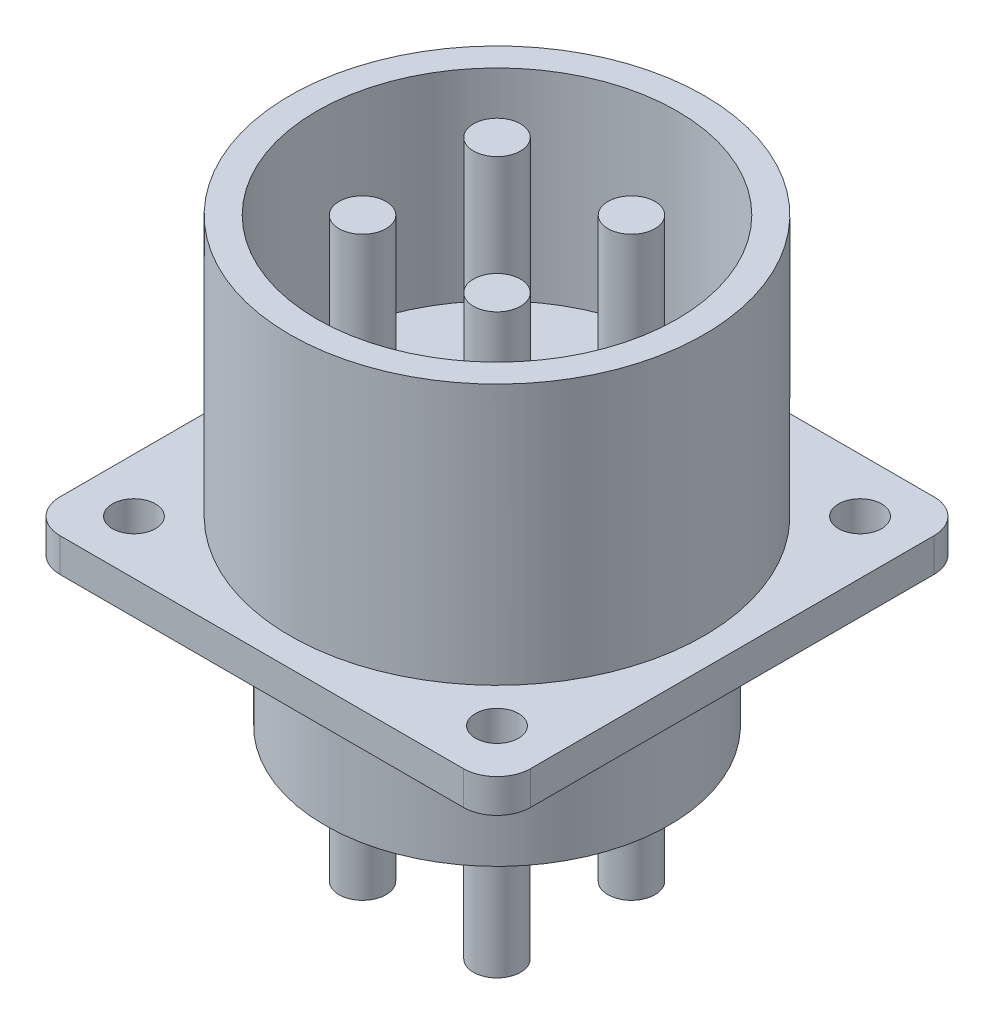
ISO-10303-21;
HEADER;
FILE_DESCRIPTION(('STEP AP214'),'2;1');
FILE_NAME('part.step','',(''),(''),'','','');
FILE_SCHEMA(('AUTOMOTIVE_DESIGN { 1 0 10303 214 1 1 1 1 }'));
ENDSEC;
DATA;
#1=APPLICATION_CONTEXT('core data for automotive mechanical design processes');
#2=APPLICATION_PROTOCOL_DEFINITION('international standard','automotive_design',2000,#1);
#3=PRODUCT_CONTEXT('',#1,'mechanical');
#4=PRODUCT('Part','Part','',(#3));
#5=PRODUCT_RELATED_PRODUCT_CATEGORY('part','',(#4));
#6=PRODUCT_DEFINITION_FORMATION('','',#4);
#7=PRODUCT_DEFINITION_CONTEXT('part definition',#1,'design');
#8=PRODUCT_DEFINITION('design','',#6,#7);
#9=PRODUCT_DEFINITION_SHAPE('','',#8);
#10=(LENGTH_UNIT() NAMED_UNIT(*) SI_UNIT(.MILLI.,.METRE.));
#11=(NAMED_UNIT(*) PLANE_ANGLE_UNIT() SI_UNIT($,.RADIAN.));
#12=(NAMED_UNIT(*) SI_UNIT($,.STERADIAN.) SOLID_ANGLE_UNIT());
#13=UNCERTAINTY_MEASURE_WITH_UNIT(LENGTH_MEASURE(1.E-05),#10,'distance_accuracy_value','');
#14=(GEOMETRIC_REPRESENTATION_CONTEXT(3) GLOBAL_UNCERTAINTY_ASSIGNED_CONTEXT((#13)) GLOBAL_UNIT_ASSIGNED_CONTEXT((#10,
#11,#12)) REPRESENTATION_CONTEXT('',''));
#15=CARTESIAN_POINT('',(0.,0.,0.));
#16=DIRECTION('',(0.,0.,1.));
#17=DIRECTION('',(1.,0.,0.));
#18=AXIS2_PLACEMENT_3D('',#15,#16,#17);
#19=CARTESIAN_POINT('',(17.5,2.5,17.5));
#20=DIRECTION('',(-1.,0.,0.));
#21=DIRECTION('',(0.,0.,1.));
#22=AXIS2_PLACEMENT_3D('',#19,#20,#21);
#23=PLANE('',#22);
#24=DIRECTION('',(0.,0.,-1.));
#25=VECTOR('',#24,1.);
#26=CARTESIAN_POINT('',(17.5,0.,17.5));
#27=LINE('',#26,#25);
#28=CARTESIAN_POINT('',(17.5,0.,15.));
#29=VERTEX_POINT('',#28);
#30=CARTESIAN_POINT('',(17.5,0.,-15.));
#31=VERTEX_POINT('',#30);
#32=EDGE_CURVE('E131',#29,#31,#27,.T.);
#33=ORIENTED_EDGE('',*,*,#32,.T.);
#34=DIRECTION('',(0.,-1.,0.));
#35=VECTOR('',#34,1.);
#36=CARTESIAN_POINT('',(17.5,2.5,-15.));
#37=LINE('',#36,#35);
#38=CARTESIAN_POINT('',(17.5,2.5,-15.));
#39=VERTEX_POINT('',#38);
#40=EDGE_CURVE('E109',#31,#39,#37,.F.);
#41=ORIENTED_EDGE('',*,*,#40,.T.);
#42=DIRECTION('',(0.,0.,-1.));
#43=VECTOR('',#42,1.);
#44=CARTESIAN_POINT('',(17.5,2.5,17.5));
#45=LINE('',#44,#43);
#46=CARTESIAN_POINT('',(17.5,2.5,15.));
#47=VERTEX_POINT('',#46);
#48=EDGE_CURVE('E141',#47,#39,#45,.T.);
#49=ORIENTED_EDGE('',*,*,#48,.F.);
#50=DIRECTION('',(0.,-1.,0.));
#51=VECTOR('',#50,1.);
#52=CARTESIAN_POINT('',(17.5,2.5,15.));
#53=LINE('',#52,#51);
#54=EDGE_CURVE('E114',#47,#29,#53,.T.);
#55=ORIENTED_EDGE('',*,*,#54,.T.);
#56=EDGE_LOOP('',(#33,#41,#49,#55));
#57=FACE_BOUND('',#56,.T.);
#58=ADVANCED_FACE('F35',(#57),#23,.F.);
#59=CARTESIAN_POINT('',(-17.5,2.5,-17.5));
#60=DIRECTION('',(0.,0.,1.));
#61=DIRECTION('',(1.,0.,0.));
#62=AXIS2_PLACEMENT_3D('',#59,#60,#61);
#63=PLANE('',#62);
#64=DIRECTION('',(-1.,0.,0.));
#65=VECTOR('',#64,1.);
#66=CARTESIAN_POINT('',(-17.5,2.5,-17.5));
#67=LINE('',#66,#65);
#68=CARTESIAN_POINT('',(15.,2.5,-17.5));
#69=VERTEX_POINT('',#68);
#70=CARTESIAN_POINT('',(-15.,2.5,-17.5));
#71=VERTEX_POINT('',#70);
#72=EDGE_CURVE('E124',#69,#71,#67,.T.);
#73=ORIENTED_EDGE('',*,*,#72,.F.);
#74=DIRECTION('',(0.,-1.,0.));
#75=VECTOR('',#74,1.);
#76=CARTESIAN_POINT('',(15.,2.5,-17.5));
#77=LINE('',#76,#75);
#78=CARTESIAN_POINT('',(15.,0.,-17.5));
#79=VERTEX_POINT('',#78);
#80=EDGE_CURVE('E108',#69,#79,#77,.T.);
#81=ORIENTED_EDGE('',*,*,#80,.T.);
#82=DIRECTION('',(-1.,0.,0.));
#83=VECTOR('',#82,1.);
#84=CARTESIAN_POINT('',(-17.5,0.,-17.5));
#85=LINE('',#84,#83);
#86=CARTESIAN_POINT('',(-15.,0.,-17.5));
#87=VERTEX_POINT('',#86);
#88=EDGE_CURVE('E121',#79,#87,#85,.T.);
#89=ORIENTED_EDGE('',*,*,#88,.T.);
#90=DIRECTION('',(0.,-1.,0.));
#91=VECTOR('',#90,1.);
#92=CARTESIAN_POINT('',(-15.,2.5,-17.5));
#93=LINE('',#92,#91);
#94=EDGE_CURVE('E126',#87,#71,#93,.F.);
#95=ORIENTED_EDGE('',*,*,#94,.T.);
#96=EDGE_LOOP('',(#73,#81,#89,#95));
#97=FACE_BOUND('',#96,.T.);
#98=ADVANCED_FACE('F120',(#97),#63,.F.);
#99=CARTESIAN_POINT('',(-17.5,2.5,17.5));
#100=DIRECTION('',(1.,0.,0.));
#101=DIRECTION('',(0.,0.,-1.));
#102=AXIS2_PLACEMENT_3D('',#99,#100,#101);
#103=PLANE('',#102);
#104=DIRECTION('',(0.,0.,1.));
#105=VECTOR('',#104,1.);
#106=CARTESIAN_POINT('',(-17.5,2.5,17.5));
#107=LINE('',#106,#105);
#108=CARTESIAN_POINT('',(-17.5,2.5,-15.));
#109=VERTEX_POINT('',#108);
#110=CARTESIAN_POINT('',(-17.5,2.5,15.));
#111=VERTEX_POINT('',#110);
#112=EDGE_CURVE('E255',#109,#111,#107,.T.);
#113=ORIENTED_EDGE('',*,*,#112,.F.);
#114=DIRECTION('',(0.,-1.,0.));
#115=VECTOR('',#114,1.);
#116=CARTESIAN_POINT('',(-17.5,2.5,-15.));
#117=LINE('',#116,#115);
#118=CARTESIAN_POINT('',(-17.5,0.,-15.));
#119=VERTEX_POINT('',#118);
#120=EDGE_CURVE('E160',#109,#119,#117,.T.);
#121=ORIENTED_EDGE('',*,*,#120,.T.);
#122=DIRECTION('',(0.,0.,1.));
#123=VECTOR('',#122,1.);
#124=CARTESIAN_POINT('',(-17.5,0.,17.5));
#125=LINE('',#124,#123);
#126=CARTESIAN_POINT('',(-17.5,0.,15.));
#127=VERTEX_POINT('',#126);
#128=EDGE_CURVE('E130',#119,#127,#125,.T.);
#129=ORIENTED_EDGE('',*,*,#128,.T.);
#130=DIRECTION('',(0.,-1.,0.));
#131=VECTOR('',#130,1.);
#132=CARTESIAN_POINT('',(-17.5,2.5,15.));
#133=LINE('',#132,#131);
#134=EDGE_CURVE('E158',#127,#111,#133,.F.);
#135=ORIENTED_EDGE('',*,*,#134,.T.);
#136=EDGE_LOOP('',(#113,#121,#129,#135));
#137=FACE_BOUND('',#136,.T.);
#138=ADVANCED_FACE('F270',(#137),#103,.F.);
#139=CARTESIAN_POINT('',(-17.5,2.5,17.5));
#140=DIRECTION('',(0.,0.,-1.));
#141=DIRECTION('',(-1.,0.,0.));
#142=AXIS2_PLACEMENT_3D('',#139,#140,#141);
#143=PLANE('',#142);
#144=DIRECTION('',(1.,0.,0.));
#145=VECTOR('',#144,1.);
#146=CARTESIAN_POINT('',(-17.5,2.5,17.5));
#147=LINE('',#146,#145);
#148=CARTESIAN_POINT('',(-15.,2.5,17.5));
#149=VERTEX_POINT('',#148);
#150=CARTESIAN_POINT('',(15.,2.5,17.5));
#151=VERTEX_POINT('',#150);
#152=EDGE_CURVE('E142',#149,#151,#147,.T.);
#153=ORIENTED_EDGE('',*,*,#152,.F.);
#154=DIRECTION('',(0.,-1.,0.));
#155=VECTOR('',#154,1.);
#156=CARTESIAN_POINT('',(-15.,2.5,17.5));
#157=LINE('',#156,#155);
#158=CARTESIAN_POINT('',(-15.,0.,17.5));
#159=VERTEX_POINT('',#158);
#160=EDGE_CURVE('E44',#149,#159,#157,.T.);
#161=ORIENTED_EDGE('',*,*,#160,.T.);
#162=DIRECTION('',(1.,0.,0.));
#163=VECTOR('',#162,1.);
#164=CARTESIAN_POINT('',(-17.5,0.,17.5));
#165=LINE('',#164,#163);
#166=CARTESIAN_POINT('',(15.,0.,17.5));
#167=VERTEX_POINT('',#166);
#168=EDGE_CURVE('E134',#159,#167,#165,.T.);
#169=ORIENTED_EDGE('',*,*,#168,.T.);
#170=DIRECTION('',(0.,-1.,0.));
#171=VECTOR('',#170,1.);
#172=CARTESIAN_POINT('',(15.,2.5,17.5));
#173=LINE('',#172,#171);
#174=EDGE_CURVE('E52',#167,#151,#173,.F.);
#175=ORIENTED_EDGE('',*,*,#174,.T.);
#176=EDGE_LOOP('',(#153,#161,#169,#175));
#177=FACE_BOUND('',#176,.T.);
#178=ADVANCED_FACE('F264',(#177),#143,.F.);
#179=CARTESIAN_POINT('',(0.,2.5,0.));
#180=DIRECTION('',(0.,-1.,0.));
#181=DIRECTION('',(0.,0.,-1.));
#182=AXIS2_PLACEMENT_3D('',#179,#180,#181);
#183=PLANE('',#182);
#184=CARTESIAN_POINT('',(13.5,2.5,-13.5));
#185=DIRECTION('',(0.,1.,0.));
#186=DIRECTION('',(0.,0.,1.));
#187=AXIS2_PLACEMENT_3D('',#184,#185,#186);
#188=CIRCLE('',#187,1.6);
#189=CARTESIAN_POINT('',(13.5,2.5,-11.9));
#190=VERTEX_POINT('',#189);
#191=EDGE_CURVE('E186',#190,#190,#188,.T.);
#192=ORIENTED_EDGE('',*,*,#191,.F.);
#193=EDGE_LOOP('',(#192));
#194=FACE_BOUND('',#193,.T.);
#195=CARTESIAN_POINT('',(13.5,2.5,13.5));
#196=DIRECTION('',(0.,1.,0.));
#197=DIRECTION('',(0.,0.,1.));
#198=AXIS2_PLACEMENT_3D('',#195,#196,#197);
#199=CIRCLE('',#198,1.6);
#200=CARTESIAN_POINT('',(13.5,2.5,15.1));
#201=VERTEX_POINT('',#200);
#202=EDGE_CURVE('E176',#201,#201,#199,.T.);
#203=ORIENTED_EDGE('',*,*,#202,.F.);
#204=EDGE_LOOP('',(#203));
#205=FACE_BOUND('',#204,.T.);
#206=CARTESIAN_POINT('',(-13.5,2.5,13.5));
#207=DIRECTION('',(0.,1.,0.));
#208=DIRECTION('',(0.,0.,1.));
#209=AXIS2_PLACEMENT_3D('',#206,#207,#208);
#210=CIRCLE('',#209,1.6);
#211=CARTESIAN_POINT('',(-13.5,2.5,15.1));
#212=VERTEX_POINT('',#211);
#213=EDGE_CURVE('E173',#212,#212,#210,.T.);
#214=ORIENTED_EDGE('',*,*,#213,.F.);
#215=EDGE_LOOP('',(#214));
#216=FACE_BOUND('',#215,.T.);
#217=CARTESIAN_POINT('',(-13.5,2.5,-13.5));
#218=DIRECTION('',(0.,1.,0.));
#219=DIRECTION('',(0.,0.,1.));
#220=AXIS2_PLACEMENT_3D('',#217,#218,#219);
#221=CIRCLE('',#220,1.6);
#222=CARTESIAN_POINT('',(-13.5,2.5,-11.9));
#223=VERTEX_POINT('',#222);
#224=EDGE_CURVE('E170',#223,#223,#221,.T.);
#225=ORIENTED_EDGE('',*,*,#224,.F.);
#226=EDGE_LOOP('',(#225));
#227=FACE_BOUND('',#226,.T.);
#228=CARTESIAN_POINT('',(0.,2.5,0.));
#229=DIRECTION('',(0.,-1.,0.));
#230=DIRECTION('',(0.,0.,-1.));
#231=AXIS2_PLACEMENT_3D('',#228,#229,#230);
#232=CIRCLE('',#231,15.4);
#233=CARTESIAN_POINT('',(0.,2.5,-15.4));
#234=VERTEX_POINT('',#233);
#235=EDGE_CURVE('E11',#234,#234,#232,.F.);
#236=ORIENTED_EDGE('',*,*,#235,.F.);
#237=EDGE_LOOP('',(#236));
#238=FACE_BOUND('',#237,.T.);
#239=ORIENTED_EDGE('',*,*,#48,.T.);
#240=CARTESIAN_POINT('',(15.,2.5,-15.));
#241=DIRECTION('',(0.,-1.,0.));
#242=DIRECTION('',(0.,0.,-1.));
#243=AXIS2_PLACEMENT_3D('',#240,#241,#242);
#244=CIRCLE('',#243,2.5);
#245=EDGE_CURVE('E156',#39,#69,#244,.F.);
#246=ORIENTED_EDGE('',*,*,#245,.T.);
#247=ORIENTED_EDGE('',*,*,#72,.T.);
#248=CARTESIAN_POINT('',(-15.,2.5,-15.));
#249=DIRECTION('',(0.,-1.,0.));
#250=DIRECTION('',(0.,0.,-1.));
#251=AXIS2_PLACEMENT_3D('',#248,#249,#250);
#252=CIRCLE('',#251,2.5);
#253=EDGE_CURVE('E154',#71,#109,#252,.F.);
#254=ORIENTED_EDGE('',*,*,#253,.T.);
#255=ORIENTED_EDGE('',*,*,#112,.T.);
#256=CARTESIAN_POINT('',(-15.,2.5,15.));
#257=DIRECTION('',(0.,-1.,0.));
#258=DIRECTION('',(0.,0.,-1.));
#259=AXIS2_PLACEMENT_3D('',#256,#257,#258);
#260=CIRCLE('',#259,2.5);
#261=EDGE_CURVE('E59',#111,#149,#260,.F.);
#262=ORIENTED_EDGE('',*,*,#261,.T.);
#263=ORIENTED_EDGE('',*,*,#152,.T.);
#264=CARTESIAN_POINT('',(15.,2.5,15.));
#265=DIRECTION('',(0.,-1.,0.));
#266=DIRECTION('',(0.,0.,-1.));
#267=AXIS2_PLACEMENT_3D('',#264,#265,#266);
#268=CIRCLE('',#267,2.5);
#269=EDGE_CURVE('E151',#151,#47,#268,.F.);
#270=ORIENTED_EDGE('',*,*,#269,.T.);
#271=EDGE_LOOP('',(#239,#246,#247,#254,#255,#262,#263,#270));
#272=FACE_BOUND('',#271,.T.);
#273=ADVANCED_FACE('F257',(#194,#205,#216,#227,#238,#272),#183,.F.);
#274=CARTESIAN_POINT('',(0.,0.,0.));
#275=DIRECTION('',(0.,-1.,0.));
#276=DIRECTION('',(0.,0.,-1.));
#277=AXIS2_PLACEMENT_3D('',#274,#275,#276);
#278=PLANE('',#277);
#279=CARTESIAN_POINT('',(13.5,0.,-13.5));
#280=DIRECTION('',(0.,-1.,0.));
#281=DIRECTION('',(0.,0.,-1.));
#282=AXIS2_PLACEMENT_3D('',#279,#280,#281);
#283=CIRCLE('',#282,1.6);
#284=CARTESIAN_POINT('',(13.5,0.,-15.1));
#285=VERTEX_POINT('',#284);
#286=EDGE_CURVE('E39',#285,#285,#283,.T.);
#287=ORIENTED_EDGE('',*,*,#286,.F.);
#288=EDGE_LOOP('',(#287));
#289=FACE_BOUND('',#288,.T.);
#290=CARTESIAN_POINT('',(13.5,0.,13.5));
#291=DIRECTION('',(0.,-1.,0.));
#292=DIRECTION('',(0.,0.,-1.));
#293=AXIS2_PLACEMENT_3D('',#290,#291,#292);
#294=CIRCLE('',#293,1.6);
#295=CARTESIAN_POINT('',(13.5,0.,11.9));
#296=VERTEX_POINT('',#295);
#297=EDGE_CURVE('E174',#296,#296,#294,.T.);
#298=ORIENTED_EDGE('',*,*,#297,.F.);
#299=EDGE_LOOP('',(#298));
#300=FACE_BOUND('',#299,.T.);
#301=CARTESIAN_POINT('',(-13.5,0.,13.5));
#302=DIRECTION('',(0.,-1.,0.));
#303=DIRECTION('',(0.,0.,-1.));
#304=AXIS2_PLACEMENT_3D('',#301,#302,#303);
#305=CIRCLE('',#304,1.6);
#306=CARTESIAN_POINT('',(-13.5,0.,11.9));
#307=VERTEX_POINT('',#306);
#308=EDGE_CURVE('E171',#307,#307,#305,.T.);
#309=ORIENTED_EDGE('',*,*,#308,.F.);
#310=EDGE_LOOP('',(#309));
#311=FACE_BOUND('',#310,.T.);
#312=CARTESIAN_POINT('',(-13.5,0.,-13.5));
#313=DIRECTION('',(0.,-1.,0.));
#314=DIRECTION('',(0.,0.,-1.));
#315=AXIS2_PLACEMENT_3D('',#312,#313,#314);
#316=CIRCLE('',#315,1.6);
#317=CARTESIAN_POINT('',(-13.5,0.,-15.1));
#318=VERTEX_POINT('',#317);
#319=EDGE_CURVE('E166',#318,#318,#316,.T.);
#320=ORIENTED_EDGE('',*,*,#319,.F.);
#321=EDGE_LOOP('',(#320));
#322=FACE_BOUND('',#321,.T.);
#323=CARTESIAN_POINT('',(0.,0.,0.));
#324=DIRECTION('',(0.,-1.,0.));
#325=DIRECTION('',(0.,0.,-1.));
#326=AXIS2_PLACEMENT_3D('',#323,#324,#325);
#327=CIRCLE('',#326,12.8);
#328=CARTESIAN_POINT('',(0.,0.,-12.8));
#329=VERTEX_POINT('',#328);
#330=EDGE_CURVE('E242',#329,#329,#327,.T.);
#331=ORIENTED_EDGE('',*,*,#330,.F.);
#332=EDGE_LOOP('',(#331));
#333=FACE_BOUND('',#332,.T.);
#334=ORIENTED_EDGE('',*,*,#88,.F.);
#335=CARTESIAN_POINT('',(15.,0.,-15.));
#336=DIRECTION('',(0.,-1.,0.));
#337=DIRECTION('',(0.,0.,-1.));
#338=AXIS2_PLACEMENT_3D('',#335,#336,#337);
#339=CIRCLE('',#338,2.5);
#340=EDGE_CURVE('E104',#79,#31,#339,.T.);
#341=ORIENTED_EDGE('',*,*,#340,.T.);
#342=ORIENTED_EDGE('',*,*,#32,.F.);
#343=CARTESIAN_POINT('',(15.,0.,15.));
#344=DIRECTION('',(0.,-1.,0.));
#345=DIRECTION('',(0.,0.,-1.));
#346=AXIS2_PLACEMENT_3D('',#343,#344,#345);
#347=CIRCLE('',#346,2.5);
#348=EDGE_CURVE('E125',#29,#167,#347,.T.);
#349=ORIENTED_EDGE('',*,*,#348,.T.);
#350=ORIENTED_EDGE('',*,*,#168,.F.);
#351=CARTESIAN_POINT('',(-15.,0.,15.));
#352=DIRECTION('',(0.,-1.,0.));
#353=DIRECTION('',(0.,0.,-1.));
#354=AXIS2_PLACEMENT_3D('',#351,#352,#353);
#355=CIRCLE('',#354,2.5);
#356=EDGE_CURVE('E145',#159,#127,#355,.T.);
#357=ORIENTED_EDGE('',*,*,#356,.T.);
#358=ORIENTED_EDGE('',*,*,#128,.F.);
#359=CARTESIAN_POINT('',(-15.,0.,-15.));
#360=DIRECTION('',(0.,-1.,0.));
#361=DIRECTION('',(0.,0.,-1.));
#362=AXIS2_PLACEMENT_3D('',#359,#360,#361);
#363=CIRCLE('',#362,2.5);
#364=EDGE_CURVE('E115',#119,#87,#363,.T.);
#365=ORIENTED_EDGE('',*,*,#364,.T.);
#366=EDGE_LOOP('',(#334,#341,#342,#349,#350,#357,#358,#365));
#367=FACE_BOUND('',#366,.T.);
#368=ADVANCED_FACE('F128',(#289,#300,#311,#322,#333,#367),#278,.T.);
#369=CARTESIAN_POINT('',(15.,2.5,-15.));
#370=DIRECTION('',(0.,-1.,0.));
#371=DIRECTION('',(0.,0.,-1.));
#372=AXIS2_PLACEMENT_3D('',#369,#370,#371);
#373=CYLINDRICAL_SURFACE('',#372,2.5);
#374=ORIENTED_EDGE('',*,*,#245,.F.);
#375=ORIENTED_EDGE('',*,*,#40,.F.);
#376=ORIENTED_EDGE('',*,*,#340,.F.);
#377=ORIENTED_EDGE('',*,*,#80,.F.);
#378=EDGE_LOOP('',(#374,#375,#376,#377));
#379=FACE_BOUND('',#378,.T.);
#380=ADVANCED_FACE('F107',(#379),#373,.T.);
#381=CARTESIAN_POINT('',(-15.,2.5,-15.));
#382=DIRECTION('',(0.,-1.,0.));
#383=DIRECTION('',(0.,0.,-1.));
#384=AXIS2_PLACEMENT_3D('',#381,#382,#383);
#385=CYLINDRICAL_SURFACE('',#384,2.5);
#386=ORIENTED_EDGE('',*,*,#253,.F.);
#387=ORIENTED_EDGE('',*,*,#94,.F.);
#388=ORIENTED_EDGE('',*,*,#364,.F.);
#389=ORIENTED_EDGE('',*,*,#120,.F.);
#390=EDGE_LOOP('',(#386,#387,#388,#389));
#391=FACE_BOUND('',#390,.T.);
#392=ADVANCED_FACE('F274',(#391),#385,.T.);
#393=CARTESIAN_POINT('',(-15.,2.5,15.));
#394=DIRECTION('',(0.,-1.,0.));
#395=DIRECTION('',(0.,0.,-1.));
#396=AXIS2_PLACEMENT_3D('',#393,#394,#395);
#397=CYLINDRICAL_SURFACE('',#396,2.5);
#398=ORIENTED_EDGE('',*,*,#261,.F.);
#399=ORIENTED_EDGE('',*,*,#134,.F.);
#400=ORIENTED_EDGE('',*,*,#356,.F.);
#401=ORIENTED_EDGE('',*,*,#160,.F.);
#402=EDGE_LOOP('',(#398,#399,#400,#401));
#403=FACE_BOUND('',#402,.T.);
#404=ADVANCED_FACE('F266',(#403),#397,.T.);
#405=CARTESIAN_POINT('',(15.,2.5,15.));
#406=DIRECTION('',(0.,-1.,0.));
#407=DIRECTION('',(0.,0.,-1.));
#408=AXIS2_PLACEMENT_3D('',#405,#406,#407);
#409=CYLINDRICAL_SURFACE('',#408,2.5);
#410=ORIENTED_EDGE('',*,*,#269,.F.);
#411=ORIENTED_EDGE('',*,*,#174,.F.);
#412=ORIENTED_EDGE('',*,*,#348,.F.);
#413=ORIENTED_EDGE('',*,*,#54,.F.);
#414=EDGE_LOOP('',(#410,#411,#412,#413));
#415=FACE_BOUND('',#414,.T.);
#416=ADVANCED_FACE('F37',(#415),#409,.T.);
#417=CARTESIAN_POINT('',(0.,21.9,0.));
#418=DIRECTION('',(0.,-1.,0.));
#419=DIRECTION('',(0.,0.,-1.));
#420=AXIS2_PLACEMENT_3D('',#417,#418,#419);
#421=CYLINDRICAL_SURFACE('',#420,15.4);
#422=CARTESIAN_POINT('',(0.,21.9,0.));
#423=DIRECTION('',(0.,1.,0.));
#424=DIRECTION('',(0.,0.,1.));
#425=AXIS2_PLACEMENT_3D('',#422,#423,#424);
#426=CIRCLE('',#425,15.4);
#427=CARTESIAN_POINT('',(0.,21.9,15.4));
#428=VERTEX_POINT('',#427);
#429=EDGE_CURVE('E136',#428,#428,#426,.T.);
#430=ORIENTED_EDGE('',*,*,#429,.F.);
#431=EDGE_LOOP('',(#430));
#432=FACE_BOUND('',#431,.T.);
#433=ORIENTED_EDGE('',*,*,#235,.T.);
#434=EDGE_LOOP('',(#433));
#435=FACE_BOUND('',#434,.T.);
#436=ADVANCED_FACE('F299',(#432,#435),#421,.T.);
#437=CARTESIAN_POINT('',(0.,21.9,0.));
#438=DIRECTION('',(0.,1.,0.));
#439=DIRECTION('',(0.,0.,1.));
#440=AXIS2_PLACEMENT_3D('',#437,#438,#439);
#441=PLANE('',#440);
#442=CARTESIAN_POINT('',(0.,21.9,0.));
#443=DIRECTION('',(0.,1.,0.));
#444=DIRECTION('',(0.,0.,1.));
#445=AXIS2_PLACEMENT_3D('',#442,#443,#444);
#446=CIRCLE('',#445,13.4);
#447=CARTESIAN_POINT('',(0.,21.9,13.4));
#448=VERTEX_POINT('',#447);
#449=EDGE_CURVE('E236',#448,#448,#446,.T.);
#450=ORIENTED_EDGE('',*,*,#449,.F.);
#451=EDGE_LOOP('',(#450));
#452=FACE_BOUND('',#451,.T.);
#453=ORIENTED_EDGE('',*,*,#429,.T.);
#454=EDGE_LOOP('',(#453));
#455=FACE_BOUND('',#454,.T.);
#456=ADVANCED_FACE('F302',(#452,#455),#441,.T.);
#457=CARTESIAN_POINT('',(0.,-11.,0.));
#458=DIRECTION('',(0.,1.,0.));
#459=DIRECTION('',(0.,0.,1.));
#460=AXIS2_PLACEMENT_3D('',#457,#458,#459);
#461=CYLINDRICAL_SURFACE('',#460,12.8);
#462=CARTESIAN_POINT('',(0.,-11.,0.));
#463=DIRECTION('',(0.,-1.,0.));
#464=DIRECTION('',(0.,0.,-1.));
#465=AXIS2_PLACEMENT_3D('',#462,#463,#464);
#466=CIRCLE('',#465,12.8);
#467=CARTESIAN_POINT('',(0.,-11.,-12.8));
#468=VERTEX_POINT('',#467);
#469=EDGE_CURVE('E245',#468,#468,#466,.T.);
#470=ORIENTED_EDGE('',*,*,#469,.F.);
#471=EDGE_LOOP('',(#470));
#472=FACE_BOUND('',#471,.T.);
#473=ORIENTED_EDGE('',*,*,#330,.T.);
#474=EDGE_LOOP('',(#473));
#475=FACE_BOUND('',#474,.T.);
#476=ADVANCED_FACE('F306',(#472,#475),#461,.T.);
#477=CARTESIAN_POINT('',(0.,-11.,0.));
#478=DIRECTION('',(0.,-1.,0.));
#479=DIRECTION('',(0.,0.,-1.));
#480=AXIS2_PLACEMENT_3D('',#477,#478,#479);
#481=PLANE('',#480);
#482=CARTESIAN_POINT('',(-5.,-11.,-5.));
#483=DIRECTION('',(0.,-1.,0.));
#484=DIRECTION('',(0.,0.,-1.));
#485=AXIS2_PLACEMENT_3D('',#482,#483,#484);
#486=CIRCLE('',#485,1.75);
#487=CARTESIAN_POINT('',(-5.,-11.,-6.75));
#488=VERTEX_POINT('',#487);
#489=EDGE_CURVE('E169',#488,#488,#486,.T.);
#490=ORIENTED_EDGE('',*,*,#489,.F.);
#491=EDGE_LOOP('',(#490));
#492=FACE_BOUND('',#491,.T.);
#493=CARTESIAN_POINT('',(-5.,-11.,5.));
#494=DIRECTION('',(0.,-1.,0.));
#495=DIRECTION('',(0.,0.,-1.));
#496=AXIS2_PLACEMENT_3D('',#493,#494,#495);
#497=CIRCLE('',#496,1.75);
#498=CARTESIAN_POINT('',(-5.,-11.,3.25));
#499=VERTEX_POINT('',#498);
#500=EDGE_CURVE('E194',#499,#499,#497,.T.);
#501=ORIENTED_EDGE('',*,*,#500,.F.);
#502=EDGE_LOOP('',(#501));
#503=FACE_BOUND('',#502,.T.);
#504=CARTESIAN_POINT('',(5.,-11.,5.));
#505=DIRECTION('',(0.,-1.,0.));
#506=DIRECTION('',(0.,0.,-1.));
#507=AXIS2_PLACEMENT_3D('',#504,#505,#506);
#508=CIRCLE('',#507,1.75);
#509=CARTESIAN_POINT('',(5.,-11.,3.25));
#510=VERTEX_POINT('',#509);
#511=EDGE_CURVE('E200',#510,#510,#508,.T.);
#512=ORIENTED_EDGE('',*,*,#511,.F.);
#513=EDGE_LOOP('',(#512));
#514=FACE_BOUND('',#513,.T.);
#515=CARTESIAN_POINT('',(5.,-11.,-5.));
#516=DIRECTION('',(0.,-1.,0.));
#517=DIRECTION('',(0.,0.,-1.));
#518=AXIS2_PLACEMENT_3D('',#515,#516,#517);
#519=CIRCLE('',#518,1.75);
#520=CARTESIAN_POINT('',(5.,-11.,-6.75));
#521=VERTEX_POINT('',#520);
#522=EDGE_CURVE('E206',#521,#521,#519,.T.);
#523=ORIENTED_EDGE('',*,*,#522,.F.);
#524=EDGE_LOOP('',(#523));
#525=FACE_BOUND('',#524,.T.);
#526=ORIENTED_EDGE('',*,*,#469,.T.);
#527=EDGE_LOOP('',(#526));
#528=FACE_BOUND('',#527,.T.);
#529=ADVANCED_FACE('F310',(#492,#503,#514,#525,#528),#481,.T.);
#530=CARTESIAN_POINT('',(0.,6.9,0.));
#531=DIRECTION('',(0.,1.,0.));
#532=DIRECTION('',(0.,0.,1.));
#533=AXIS2_PLACEMENT_3D('',#530,#531,#532);
#534=CYLINDRICAL_SURFACE('',#533,13.4);
#535=CARTESIAN_POINT('',(0.,6.9,0.));
#536=DIRECTION('',(0.,1.,0.));
#537=DIRECTION('',(0.,0.,1.));
#538=AXIS2_PLACEMENT_3D('',#535,#536,#537);
#539=CIRCLE('',#538,13.4);
#540=CARTESIAN_POINT('',(0.,6.9,13.4));
#541=VERTEX_POINT('',#540);
#542=EDGE_CURVE('E239',#541,#541,#539,.T.);
#543=ORIENTED_EDGE('',*,*,#542,.F.);
#544=EDGE_LOOP('',(#543));
#545=FACE_BOUND('',#544,.T.);
#546=ORIENTED_EDGE('',*,*,#449,.T.);
#547=EDGE_LOOP('',(#546));
#548=FACE_BOUND('',#547,.T.);
#549=ADVANCED_FACE('F314',(#545,#548),#534,.F.);
#550=CARTESIAN_POINT('',(0.,6.9,0.));
#551=DIRECTION('',(0.,1.,0.));
#552=DIRECTION('',(0.,0.,1.));
#553=AXIS2_PLACEMENT_3D('',#550,#551,#552);
#554=PLANE('',#553);
#555=CARTESIAN_POINT('',(5.,6.9,-5.));
#556=DIRECTION('',(0.,1.,0.));
#557=DIRECTION('',(0.,0.,1.));
#558=AXIS2_PLACEMENT_3D('',#555,#556,#557);
#559=CIRCLE('',#558,1.75);
#560=CARTESIAN_POINT('',(5.,6.9,-3.25));
#561=VERTEX_POINT('',#560);
#562=EDGE_CURVE('E212',#561,#561,#559,.T.);
#563=ORIENTED_EDGE('',*,*,#562,.F.);
#564=EDGE_LOOP('',(#563));
#565=FACE_BOUND('',#564,.T.);
#566=CARTESIAN_POINT('',(5.,6.9,5.));
#567=DIRECTION('',(0.,1.,0.));
#568=DIRECTION('',(0.,0.,1.));
#569=AXIS2_PLACEMENT_3D('',#566,#567,#568);
#570=CIRCLE('',#569,1.75);
#571=CARTESIAN_POINT('',(5.,6.9,6.75));
#572=VERTEX_POINT('',#571);
#573=EDGE_CURVE('E218',#572,#572,#570,.T.);
#574=ORIENTED_EDGE('',*,*,#573,.F.);
#575=EDGE_LOOP('',(#574));
#576=FACE_BOUND('',#575,.T.);
#577=CARTESIAN_POINT('',(-5.,6.9,5.));
#578=DIRECTION('',(0.,1.,0.));
#579=DIRECTION('',(0.,0.,1.));
#580=AXIS2_PLACEMENT_3D('',#577,#578,#579);
#581=CIRCLE('',#580,1.75);
#582=CARTESIAN_POINT('',(-5.,6.9,6.75));
#583=VERTEX_POINT('',#582);
#584=EDGE_CURVE('E224',#583,#583,#581,.T.);
#585=ORIENTED_EDGE('',*,*,#584,.F.);
#586=EDGE_LOOP('',(#585));
#587=FACE_BOUND('',#586,.T.);
#588=CARTESIAN_POINT('',(-5.,6.9,-5.));
#589=DIRECTION('',(0.,1.,0.));
#590=DIRECTION('',(0.,0.,1.));
#591=AXIS2_PLACEMENT_3D('',#588,#589,#590);
#592=CIRCLE('',#591,1.75);
#593=CARTESIAN_POINT('',(-5.,6.9,-3.25));
#594=VERTEX_POINT('',#593);
#595=EDGE_CURVE('E230',#594,#594,#592,.T.);
#596=ORIENTED_EDGE('',*,*,#595,.F.);
#597=EDGE_LOOP('',(#596));
#598=FACE_BOUND('',#597,.T.);
#599=ORIENTED_EDGE('',*,*,#542,.T.);
#600=EDGE_LOOP('',(#599));
#601=FACE_BOUND('',#600,.T.);
#602=ADVANCED_FACE('F318',(#565,#576,#587,#598,#601),#554,.T.);
#603=CARTESIAN_POINT('',(-5.,21.9,-5.));
#604=DIRECTION('',(0.,-1.,0.));
#605=DIRECTION('',(0.,0.,-1.));
#606=AXIS2_PLACEMENT_3D('',#603,#604,#605);
#607=CYLINDRICAL_SURFACE('',#606,1.75);
#608=CARTESIAN_POINT('',(-5.,21.9,-5.));
#609=DIRECTION('',(0.,1.,0.));
#610=DIRECTION('',(0.,0.,1.));
#611=AXIS2_PLACEMENT_3D('',#608,#609,#610);
#612=CIRCLE('',#611,1.75);
#613=CARTESIAN_POINT('',(-5.,21.9,-3.25));
#614=VERTEX_POINT('',#613);
#615=EDGE_CURVE('E233',#614,#614,#612,.T.);
#616=ORIENTED_EDGE('',*,*,#615,.F.);
#617=EDGE_LOOP('',(#616));
#618=FACE_BOUND('',#617,.T.);
#619=ORIENTED_EDGE('',*,*,#595,.T.);
#620=EDGE_LOOP('',(#619));
#621=FACE_BOUND('',#620,.T.);
#622=ADVANCED_FACE('F322',(#618,#621),#607,.T.);
#623=CARTESIAN_POINT('',(-5.,21.9,-5.));
#624=DIRECTION('',(0.,1.,0.));
#625=DIRECTION('',(0.,0.,1.));
#626=AXIS2_PLACEMENT_3D('',#623,#624,#625);
#627=PLANE('',#626);
#628=ORIENTED_EDGE('',*,*,#615,.T.);
#629=EDGE_LOOP('',(#628));
#630=FACE_BOUND('',#629,.T.);
#631=ADVANCED_FACE('F326',(#630),#627,.T.);
#632=CARTESIAN_POINT('',(-5.,21.9,5.));
#633=DIRECTION('',(0.,-1.,0.));
#634=DIRECTION('',(0.,0.,-1.));
#635=AXIS2_PLACEMENT_3D('',#632,#633,#634);
#636=CYLINDRICAL_SURFACE('',#635,1.75);
#637=CARTESIAN_POINT('',(-5.,21.9,5.));
#638=DIRECTION('',(0.,1.,0.));
#639=DIRECTION('',(0.,0.,1.));
#640=AXIS2_PLACEMENT_3D('',#637,#638,#639);
#641=CIRCLE('',#640,1.75);
#642=CARTESIAN_POINT('',(-5.,21.9,6.75));
#643=VERTEX_POINT('',#642);
#644=EDGE_CURVE('E227',#643,#643,#641,.T.);
#645=ORIENTED_EDGE('',*,*,#644,.F.);
#646=EDGE_LOOP('',(#645));
#647=FACE_BOUND('',#646,.T.);
#648=ORIENTED_EDGE('',*,*,#584,.T.);
#649=EDGE_LOOP('',(#648));
#650=FACE_BOUND('',#649,.T.);
#651=ADVANCED_FACE('F330',(#647,#650),#636,.T.);
#652=CARTESIAN_POINT('',(-5.,21.9,5.));
#653=DIRECTION('',(0.,1.,0.));
#654=DIRECTION('',(0.,0.,1.));
#655=AXIS2_PLACEMENT_3D('',#652,#653,#654);
#656=PLANE('',#655);
#657=ORIENTED_EDGE('',*,*,#644,.T.);
#658=EDGE_LOOP('',(#657));
#659=FACE_BOUND('',#658,.T.);
#660=ADVANCED_FACE('F334',(#659),#656,.T.);
#661=CARTESIAN_POINT('',(5.,21.9,5.));
#662=DIRECTION('',(0.,-1.,0.));
#663=DIRECTION('',(0.,0.,-1.));
#664=AXIS2_PLACEMENT_3D('',#661,#662,#663);
#665=CYLINDRICAL_SURFACE('',#664,1.75);
#666=CARTESIAN_POINT('',(5.,21.9,5.));
#667=DIRECTION('',(0.,1.,0.));
#668=DIRECTION('',(0.,0.,1.));
#669=AXIS2_PLACEMENT_3D('',#666,#667,#668);
#670=CIRCLE('',#669,1.75);
#671=CARTESIAN_POINT('',(5.,21.9,6.75));
#672=VERTEX_POINT('',#671);
#673=EDGE_CURVE('E221',#672,#672,#670,.T.);
#674=ORIENTED_EDGE('',*,*,#673,.F.);
#675=EDGE_LOOP('',(#674));
#676=FACE_BOUND('',#675,.T.);
#677=ORIENTED_EDGE('',*,*,#573,.T.);
#678=EDGE_LOOP('',(#677));
#679=FACE_BOUND('',#678,.T.);
#680=ADVANCED_FACE('F338',(#676,#679),#665,.T.);
#681=CARTESIAN_POINT('',(5.,21.9,5.));
#682=DIRECTION('',(0.,1.,0.));
#683=DIRECTION('',(0.,0.,1.));
#684=AXIS2_PLACEMENT_3D('',#681,#682,#683);
#685=PLANE('',#684);
#686=ORIENTED_EDGE('',*,*,#673,.T.);
#687=EDGE_LOOP('',(#686));
#688=FACE_BOUND('',#687,.T.);
#689=ADVANCED_FACE('F342',(#688),#685,.T.);
#690=CARTESIAN_POINT('',(5.,21.9,-5.));
#691=DIRECTION('',(0.,-1.,0.));
#692=DIRECTION('',(0.,0.,-1.));
#693=AXIS2_PLACEMENT_3D('',#690,#691,#692);
#694=CYLINDRICAL_SURFACE('',#693,1.75);
#695=CARTESIAN_POINT('',(5.,21.9,-5.));
#696=DIRECTION('',(0.,1.,0.));
#697=DIRECTION('',(0.,0.,1.));
#698=AXIS2_PLACEMENT_3D('',#695,#696,#697);
#699=CIRCLE('',#698,1.75);
#700=CARTESIAN_POINT('',(5.,21.9,-3.25));
#701=VERTEX_POINT('',#700);
#702=EDGE_CURVE('E215',#701,#701,#699,.T.);
#703=ORIENTED_EDGE('',*,*,#702,.F.);
#704=EDGE_LOOP('',(#703));
#705=FACE_BOUND('',#704,.T.);
#706=ORIENTED_EDGE('',*,*,#562,.T.);
#707=EDGE_LOOP('',(#706));
#708=FACE_BOUND('',#707,.T.);
#709=ADVANCED_FACE('F346',(#705,#708),#694,.T.);
#710=CARTESIAN_POINT('',(5.,21.9,-5.));
#711=DIRECTION('',(0.,1.,0.));
#712=DIRECTION('',(0.,0.,1.));
#713=AXIS2_PLACEMENT_3D('',#710,#711,#712);
#714=PLANE('',#713);
#715=ORIENTED_EDGE('',*,*,#702,.T.);
#716=EDGE_LOOP('',(#715));
#717=FACE_BOUND('',#716,.T.);
#718=ADVANCED_FACE('F350',(#717),#714,.T.);
#719=CARTESIAN_POINT('',(5.,-21.,-5.));
#720=DIRECTION('',(0.,1.,0.));
#721=DIRECTION('',(0.,0.,1.));
#722=AXIS2_PLACEMENT_3D('',#719,#720,#721);
#723=CYLINDRICAL_SURFACE('',#722,1.75);
#724=CARTESIAN_POINT('',(5.,-21.,-5.));
#725=DIRECTION('',(0.,-1.,0.));
#726=DIRECTION('',(0.,0.,-1.));
#727=AXIS2_PLACEMENT_3D('',#724,#725,#726);
#728=CIRCLE('',#727,1.75);
#729=CARTESIAN_POINT('',(5.,-21.,-6.75));
#730=VERTEX_POINT('',#729);
#731=EDGE_CURVE('E209',#730,#730,#728,.T.);
#732=ORIENTED_EDGE('',*,*,#731,.F.);
#733=EDGE_LOOP('',(#732));
#734=FACE_BOUND('',#733,.T.);
#735=ORIENTED_EDGE('',*,*,#522,.T.);
#736=EDGE_LOOP('',(#735));
#737=FACE_BOUND('',#736,.T.);
#738=ADVANCED_FACE('F354',(#734,#737),#723,.T.);
#739=CARTESIAN_POINT('',(5.,-21.,-5.));
#740=DIRECTION('',(0.,-1.,0.));
#741=DIRECTION('',(0.,0.,-1.));
#742=AXIS2_PLACEMENT_3D('',#739,#740,#741);
#743=PLANE('',#742);
#744=ORIENTED_EDGE('',*,*,#731,.T.);
#745=EDGE_LOOP('',(#744));
#746=FACE_BOUND('',#745,.T.);
#747=ADVANCED_FACE('F358',(#746),#743,.T.);
#748=CARTESIAN_POINT('',(5.,-21.,5.));
#749=DIRECTION('',(0.,1.,0.));
#750=DIRECTION('',(0.,0.,1.));
#751=AXIS2_PLACEMENT_3D('',#748,#749,#750);
#752=CYLINDRICAL_SURFACE('',#751,1.75);
#753=CARTESIAN_POINT('',(5.,-21.,5.));
#754=DIRECTION('',(0.,-1.,0.));
#755=DIRECTION('',(0.,0.,-1.));
#756=AXIS2_PLACEMENT_3D('',#753,#754,#755);
#757=CIRCLE('',#756,1.75);
#758=CARTESIAN_POINT('',(5.,-21.,3.25));
#759=VERTEX_POINT('',#758);
#760=EDGE_CURVE('E203',#759,#759,#757,.T.);
#761=ORIENTED_EDGE('',*,*,#760,.F.);
#762=EDGE_LOOP('',(#761));
#763=FACE_BOUND('',#762,.T.);
#764=ORIENTED_EDGE('',*,*,#511,.T.);
#765=EDGE_LOOP('',(#764));
#766=FACE_BOUND('',#765,.T.);
#767=ADVANCED_FACE('F362',(#763,#766),#752,.T.);
#768=CARTESIAN_POINT('',(5.,-21.,5.));
#769=DIRECTION('',(0.,-1.,0.));
#770=DIRECTION('',(0.,0.,-1.));
#771=AXIS2_PLACEMENT_3D('',#768,#769,#770);
#772=PLANE('',#771);
#773=ORIENTED_EDGE('',*,*,#760,.T.);
#774=EDGE_LOOP('',(#773));
#775=FACE_BOUND('',#774,.T.);
#776=ADVANCED_FACE('F366',(#775),#772,.T.);
#777=CARTESIAN_POINT('',(-5.,-21.,5.));
#778=DIRECTION('',(0.,1.,0.));
#779=DIRECTION('',(0.,0.,1.));
#780=AXIS2_PLACEMENT_3D('',#777,#778,#779);
#781=CYLINDRICAL_SURFACE('',#780,1.75);
#782=CARTESIAN_POINT('',(-5.,-21.,5.));
#783=DIRECTION('',(0.,-1.,0.));
#784=DIRECTION('',(0.,0.,-1.));
#785=AXIS2_PLACEMENT_3D('',#782,#783,#784);
#786=CIRCLE('',#785,1.75);
#787=CARTESIAN_POINT('',(-5.,-21.,3.25));
#788=VERTEX_POINT('',#787);
#789=EDGE_CURVE('E197',#788,#788,#786,.T.);
#790=ORIENTED_EDGE('',*,*,#789,.F.);
#791=EDGE_LOOP('',(#790));
#792=FACE_BOUND('',#791,.T.);
#793=ORIENTED_EDGE('',*,*,#500,.T.);
#794=EDGE_LOOP('',(#793));
#795=FACE_BOUND('',#794,.T.);
#796=ADVANCED_FACE('F370',(#792,#795),#781,.T.);
#797=CARTESIAN_POINT('',(-5.,-21.,5.));
#798=DIRECTION('',(0.,-1.,0.));
#799=DIRECTION('',(0.,0.,-1.));
#800=AXIS2_PLACEMENT_3D('',#797,#798,#799);
#801=PLANE('',#800);
#802=ORIENTED_EDGE('',*,*,#789,.T.);
#803=EDGE_LOOP('',(#802));
#804=FACE_BOUND('',#803,.T.);
#805=ADVANCED_FACE('F374',(#804),#801,.T.);
#806=CARTESIAN_POINT('',(-5.,-21.,-5.));
#807=DIRECTION('',(0.,1.,0.));
#808=DIRECTION('',(0.,0.,1.));
#809=AXIS2_PLACEMENT_3D('',#806,#807,#808);
#810=CYLINDRICAL_SURFACE('',#809,1.75);
#811=CARTESIAN_POINT('',(-5.,-21.,-5.));
#812=DIRECTION('',(0.,-1.,0.));
#813=DIRECTION('',(0.,0.,-1.));
#814=AXIS2_PLACEMENT_3D('',#811,#812,#813);
#815=CIRCLE('',#814,1.75);
#816=CARTESIAN_POINT('',(-5.,-21.,-6.75));
#817=VERTEX_POINT('',#816);
#818=EDGE_CURVE('E191',#817,#817,#815,.T.);
#819=ORIENTED_EDGE('',*,*,#818,.F.);
#820=EDGE_LOOP('',(#819));
#821=FACE_BOUND('',#820,.T.);
#822=ORIENTED_EDGE('',*,*,#489,.T.);
#823=EDGE_LOOP('',(#822));
#824=FACE_BOUND('',#823,.T.);
#825=ADVANCED_FACE('F378',(#821,#824),#810,.T.);
#826=CARTESIAN_POINT('',(-5.,-21.,-5.));
#827=DIRECTION('',(0.,-1.,0.));
#828=DIRECTION('',(0.,0.,-1.));
#829=AXIS2_PLACEMENT_3D('',#826,#827,#828);
#830=PLANE('',#829);
#831=ORIENTED_EDGE('',*,*,#818,.T.);
#832=EDGE_LOOP('',(#831));
#833=FACE_BOUND('',#832,.T.);
#834=ADVANCED_FACE('F382',(#833),#830,.T.);
#835=CARTESIAN_POINT('',(-13.5,-21.,-13.5));
#836=DIRECTION('',(0.,1.,0.));
#837=DIRECTION('',(0.,0.,1.));
#838=AXIS2_PLACEMENT_3D('',#835,#836,#837);
#839=CYLINDRICAL_SURFACE('',#838,1.6);
#840=ORIENTED_EDGE('',*,*,#319,.T.);
#841=EDGE_LOOP('',(#840));
#842=FACE_BOUND('',#841,.T.);
#843=ORIENTED_EDGE('',*,*,#224,.T.);
#844=EDGE_LOOP('',(#843));
#845=FACE_BOUND('',#844,.T.);
#846=ADVANCED_FACE('F386',(#842,#845),#839,.F.);
#847=CARTESIAN_POINT('',(-13.5,-21.,13.5));
#848=DIRECTION('',(0.,1.,0.));
#849=DIRECTION('',(0.,0.,1.));
#850=AXIS2_PLACEMENT_3D('',#847,#848,#849);
#851=CYLINDRICAL_SURFACE('',#850,1.6);
#852=ORIENTED_EDGE('',*,*,#308,.T.);
#853=EDGE_LOOP('',(#852));
#854=FACE_BOUND('',#853,.T.);
#855=ORIENTED_EDGE('',*,*,#213,.T.);
#856=EDGE_LOOP('',(#855));
#857=FACE_BOUND('',#856,.T.);
#858=ADVANCED_FACE('F390',(#854,#857),#851,.F.);
#859=CARTESIAN_POINT('',(13.5,-21.,13.5));
#860=DIRECTION('',(0.,1.,0.));
#861=DIRECTION('',(0.,0.,1.));
#862=AXIS2_PLACEMENT_3D('',#859,#860,#861);
#863=CYLINDRICAL_SURFACE('',#862,1.6);
#864=ORIENTED_EDGE('',*,*,#297,.T.);
#865=EDGE_LOOP('',(#864));
#866=FACE_BOUND('',#865,.T.);
#867=ORIENTED_EDGE('',*,*,#202,.T.);
#868=EDGE_LOOP('',(#867));
#869=FACE_BOUND('',#868,.T.);
#870=ADVANCED_FACE('F394',(#866,#869),#863,.F.);
#871=CARTESIAN_POINT('',(13.5,-21.,-13.5));
#872=DIRECTION('',(0.,1.,0.));
#873=DIRECTION('',(0.,0.,1.));
#874=AXIS2_PLACEMENT_3D('',#871,#872,#873);
#875=CYLINDRICAL_SURFACE('',#874,1.6);
#876=ORIENTED_EDGE('',*,*,#286,.T.);
#877=EDGE_LOOP('',(#876));
#878=FACE_BOUND('',#877,.T.);
#879=ORIENTED_EDGE('',*,*,#191,.T.);
#880=EDGE_LOOP('',(#879));
#881=FACE_BOUND('',#880,.T.);
#882=ADVANCED_FACE('F398',(#878,#881),#875,.F.);
#883=CLOSED_SHELL('',(#58,#98,#138,#178,#273,#368,#380,#392,#404,#416,#436,#456,#476,#529,#549,
#602,#622,#631,#651,#660,#680,#689,#709,#718,#738,#747,#767,#776,#796,#805,#825,#834,#846,#858,
#870,#882));
#884=MANIFOLD_SOLID_BREP('B2',#883);
#885=ADVANCED_BREP_SHAPE_REPRESENTATION('',(#18,#884),#14);
#886=SHAPE_DEFINITION_REPRESENTATION(#9,#885);
ENDSEC;
END-ISO-10303-21;
